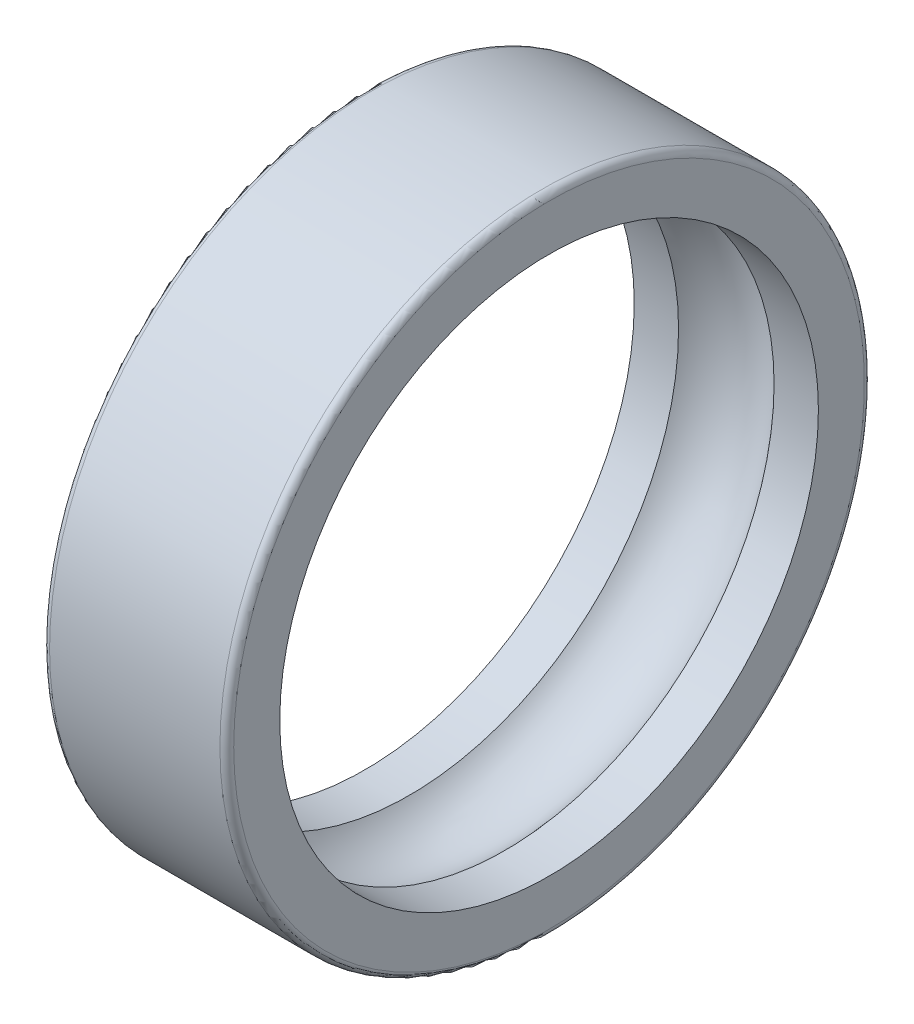
ISO-10303-21;
HEADER;
FILE_DESCRIPTION(('STEP AP214'),'2;1');
FILE_NAME('part.step','',(''),(''),'','','');
FILE_SCHEMA(('AUTOMOTIVE_DESIGN { 1 0 10303 214 1 1 1 1 }'));
ENDSEC;
DATA;
#1=APPLICATION_CONTEXT('core data for automotive mechanical design processes');
#2=APPLICATION_PROTOCOL_DEFINITION('international standard','automotive_design',2000,#1);
#3=PRODUCT_CONTEXT('',#1,'mechanical');
#4=PRODUCT('Part','Part','',(#3));
#5=PRODUCT_RELATED_PRODUCT_CATEGORY('part','',(#4));
#6=PRODUCT_DEFINITION_FORMATION('','',#4);
#7=PRODUCT_DEFINITION_CONTEXT('part definition',#1,'design');
#8=PRODUCT_DEFINITION('design','',#6,#7);
#9=PRODUCT_DEFINITION_SHAPE('','',#8);
#10=(LENGTH_UNIT() NAMED_UNIT(*) SI_UNIT(.MILLI.,.METRE.));
#11=(NAMED_UNIT(*) PLANE_ANGLE_UNIT() SI_UNIT($,.RADIAN.));
#12=(NAMED_UNIT(*) SI_UNIT($,.STERADIAN.) SOLID_ANGLE_UNIT());
#13=UNCERTAINTY_MEASURE_WITH_UNIT(LENGTH_MEASURE(1.E-05),#10,'distance_accuracy_value','');
#14=(GEOMETRIC_REPRESENTATION_CONTEXT(3) GLOBAL_UNCERTAINTY_ASSIGNED_CONTEXT((#13)) GLOBAL_UNIT_ASSIGNED_CONTEXT((#10,
#11,#12)) REPRESENTATION_CONTEXT('',''));
#15=CARTESIAN_POINT('',(0.,0.,0.));
#16=DIRECTION('',(0.,0.,1.));
#17=DIRECTION('',(1.,0.,0.));
#18=AXIS2_PLACEMENT_3D('',#15,#16,#17);
#19=CARTESIAN_POINT('',(0.,13.7,0.));
#20=DIRECTION('',(1.,0.,0.));
#21=DIRECTION('',(0.,0.,-1.));
#22=AXIS2_PLACEMENT_3D('',#19,#20,#21);
#23=PLANE('',#22);
#24=CARTESIAN_POINT('',(0.,0.,0.));
#25=DIRECTION('',(-1.,0.,0.));
#26=DIRECTION('',(0.,0.,1.));
#27=AXIS2_PLACEMENT_3D('',#24,#25,#26);
#28=CIRCLE('',#27,11.7);
#29=CARTESIAN_POINT('',(0.,0.,11.7));
#30=VERTEX_POINT('',#29);
#31=EDGE_CURVE('E10',#30,#30,#28,.T.);
#32=ORIENTED_EDGE('',*,*,#31,.F.);
#33=EDGE_LOOP('',(#32));
#34=FACE_BOUND('',#33,.T.);
#35=CARTESIAN_POINT('',(0.,0.,0.));
#36=DIRECTION('',(-1.,0.,0.));
#37=DIRECTION('',(0.,0.,1.));
#38=AXIS2_PLACEMENT_3D('',#35,#36,#37);
#39=CIRCLE('',#38,13.7);
#40=CARTESIAN_POINT('',(0.,0.,13.7));
#41=VERTEX_POINT('',#40);
#42=EDGE_CURVE('E43',#41,#41,#39,.T.);
#43=ORIENTED_EDGE('',*,*,#42,.T.);
#44=EDGE_LOOP('',(#43));
#45=FACE_BOUND('',#44,.T.);
#46=ADVANCED_FACE('F15',(#34,#45),#23,.F.);
#47=CARTESIAN_POINT('',(0.,0.,0.));
#48=DIRECTION('',(-1.,0.,0.));
#49=DIRECTION('',(0.,0.,1.));
#50=AXIS2_PLACEMENT_3D('',#47,#48,#49);
#51=CYLINDRICAL_SURFACE('',#50,11.7);
#52=CARTESIAN_POINT('',(1.92503346747204,0.,0.));
#53=DIRECTION('',(-1.,0.,0.));
#54=DIRECTION('',(0.,0.,1.));
#55=AXIS2_PLACEMENT_3D('',#52,#53,#54);
#56=CIRCLE('',#55,11.7);
#57=CARTESIAN_POINT('',(1.92503346747204,0.,11.7));
#58=VERTEX_POINT('',#57);
#59=EDGE_CURVE('E21',#58,#58,#56,.T.);
#60=ORIENTED_EDGE('',*,*,#59,.F.);
#61=EDGE_LOOP('',(#60));
#62=FACE_BOUND('',#61,.T.);
#63=ORIENTED_EDGE('',*,*,#31,.T.);
#64=EDGE_LOOP('',(#63));
#65=FACE_BOUND('',#64,.T.);
#66=ADVANCED_FACE('F80',(#62,#65),#51,.F.);
#67=CARTESIAN_POINT('',(4.,0.,0.));
#68=DIRECTION('',(-1.,0.,0.));
#69=DIRECTION('',(0.,0.,1.));
#70=AXIS2_PLACEMENT_3D('',#67,#68,#69);
#71=TOROIDAL_SURFACE('',#70,10.025,2.66666666666666);
#72=ORIENTED_EDGE('',*,*,#59,.T.);
#73=EDGE_LOOP('',(#72));
#74=FACE_BOUND('',#73,.T.);
#75=CARTESIAN_POINT('',(6.07496653252796,0.,0.));
#76=DIRECTION('',(-1.,0.,0.));
#77=DIRECTION('',(0.,0.,1.));
#78=AXIS2_PLACEMENT_3D('',#75,#76,#77);
#79=CIRCLE('',#78,11.7);
#80=CARTESIAN_POINT('',(6.07496653252796,0.,11.7));
#81=VERTEX_POINT('',#80);
#82=EDGE_CURVE('E25',#81,#81,#79,.T.);
#83=ORIENTED_EDGE('',*,*,#82,.F.);
#84=EDGE_LOOP('',(#83));
#85=FACE_BOUND('',#84,.T.);
#86=ADVANCED_FACE('F75',(#74,#85),#71,.F.);
#87=CARTESIAN_POINT('',(0.,0.,0.));
#88=DIRECTION('',(-1.,0.,0.));
#89=DIRECTION('',(0.,0.,1.));
#90=AXIS2_PLACEMENT_3D('',#87,#88,#89);
#91=CYLINDRICAL_SURFACE('',#90,11.7);
#92=CARTESIAN_POINT('',(8.,0.,0.));
#93=DIRECTION('',(-1.,0.,0.));
#94=DIRECTION('',(0.,0.,1.));
#95=AXIS2_PLACEMENT_3D('',#92,#93,#94);
#96=CIRCLE('',#95,11.7);
#97=CARTESIAN_POINT('',(8.,0.,11.7));
#98=VERTEX_POINT('',#97);
#99=EDGE_CURVE('E29',#98,#98,#96,.T.);
#100=ORIENTED_EDGE('',*,*,#99,.F.);
#101=EDGE_LOOP('',(#100));
#102=FACE_BOUND('',#101,.T.);
#103=ORIENTED_EDGE('',*,*,#82,.T.);
#104=EDGE_LOOP('',(#103));
#105=FACE_BOUND('',#104,.T.);
#106=ADVANCED_FACE('F69',(#102,#105),#91,.F.);
#107=CARTESIAN_POINT('',(8.,11.7,0.));
#108=DIRECTION('',(-1.,0.,0.));
#109=DIRECTION('',(0.,0.,1.));
#110=AXIS2_PLACEMENT_3D('',#107,#108,#109);
#111=PLANE('',#110);
#112=CARTESIAN_POINT('',(8.,0.,0.));
#113=DIRECTION('',(-1.,0.,0.));
#114=DIRECTION('',(0.,0.,1.));
#115=AXIS2_PLACEMENT_3D('',#112,#113,#114);
#116=CIRCLE('',#115,13.7);
#117=CARTESIAN_POINT('',(8.,0.,13.7));
#118=VERTEX_POINT('',#117);
#119=EDGE_CURVE('E34',#118,#118,#116,.T.);
#120=ORIENTED_EDGE('',*,*,#119,.F.);
#121=EDGE_LOOP('',(#120));
#122=FACE_BOUND('',#121,.T.);
#123=ORIENTED_EDGE('',*,*,#99,.T.);
#124=EDGE_LOOP('',(#123));
#125=FACE_BOUND('',#124,.T.);
#126=ADVANCED_FACE('F63',(#122,#125),#111,.F.);
#127=CARTESIAN_POINT('',(7.7,0.,0.));
#128=DIRECTION('',(-1.,0.,0.));
#129=DIRECTION('',(0.,0.,1.));
#130=AXIS2_PLACEMENT_3D('',#127,#128,#129);
#131=TOROIDAL_SURFACE('',#130,13.7,0.3);
#132=CARTESIAN_POINT('',(7.7,0.,0.));
#133=DIRECTION('',(-1.,0.,0.));
#134=DIRECTION('',(0.,0.,1.));
#135=AXIS2_PLACEMENT_3D('',#132,#133,#134);
#136=CIRCLE('',#135,14.);
#137=CARTESIAN_POINT('',(7.7,0.,14.));
#138=VERTEX_POINT('',#137);
#139=EDGE_CURVE('E37',#138,#138,#136,.T.);
#140=ORIENTED_EDGE('',*,*,#139,.F.);
#141=EDGE_LOOP('',(#140));
#142=FACE_BOUND('',#141,.T.);
#143=ORIENTED_EDGE('',*,*,#119,.T.);
#144=EDGE_LOOP('',(#143));
#145=FACE_BOUND('',#144,.T.);
#146=ADVANCED_FACE('F57',(#142,#145),#131,.T.);
#147=CARTESIAN_POINT('',(0.,0.,0.));
#148=DIRECTION('',(-1.,0.,0.));
#149=DIRECTION('',(0.,0.,1.));
#150=AXIS2_PLACEMENT_3D('',#147,#148,#149);
#151=CYLINDRICAL_SURFACE('',#150,14.);
#152=CARTESIAN_POINT('',(0.3,0.,0.));
#153=DIRECTION('',(-1.,0.,0.));
#154=DIRECTION('',(0.,0.,1.));
#155=AXIS2_PLACEMENT_3D('',#152,#153,#154);
#156=CIRCLE('',#155,14.);
#157=CARTESIAN_POINT('',(0.3,0.,14.));
#158=VERTEX_POINT('',#157);
#159=EDGE_CURVE('E40',#158,#158,#156,.T.);
#160=ORIENTED_EDGE('',*,*,#159,.F.);
#161=EDGE_LOOP('',(#160));
#162=FACE_BOUND('',#161,.T.);
#163=ORIENTED_EDGE('',*,*,#139,.T.);
#164=EDGE_LOOP('',(#163));
#165=FACE_BOUND('',#164,.T.);
#166=ADVANCED_FACE('F51',(#162,#165),#151,.T.);
#167=CARTESIAN_POINT('',(0.3,0.,0.));
#168=DIRECTION('',(-1.,0.,0.));
#169=DIRECTION('',(0.,0.,1.));
#170=AXIS2_PLACEMENT_3D('',#167,#168,#169);
#171=TOROIDAL_SURFACE('',#170,13.7,0.3);
#172=ORIENTED_EDGE('',*,*,#42,.F.);
#173=EDGE_LOOP('',(#172));
#174=FACE_BOUND('',#173,.T.);
#175=ORIENTED_EDGE('',*,*,#159,.T.);
#176=EDGE_LOOP('',(#175));
#177=FACE_BOUND('',#176,.T.);
#178=ADVANCED_FACE('F48',(#174,#177),#171,.T.);
#179=CLOSED_SHELL('',(#46,#66,#86,#106,#126,#146,#166,#178));
#180=MANIFOLD_SOLID_BREP('B1',#179);
#181=ADVANCED_BREP_SHAPE_REPRESENTATION('',(#18,#180),#14);
#182=SHAPE_DEFINITION_REPRESENTATION(#9,#181);
ENDSEC;
END-ISO-10303-21;
